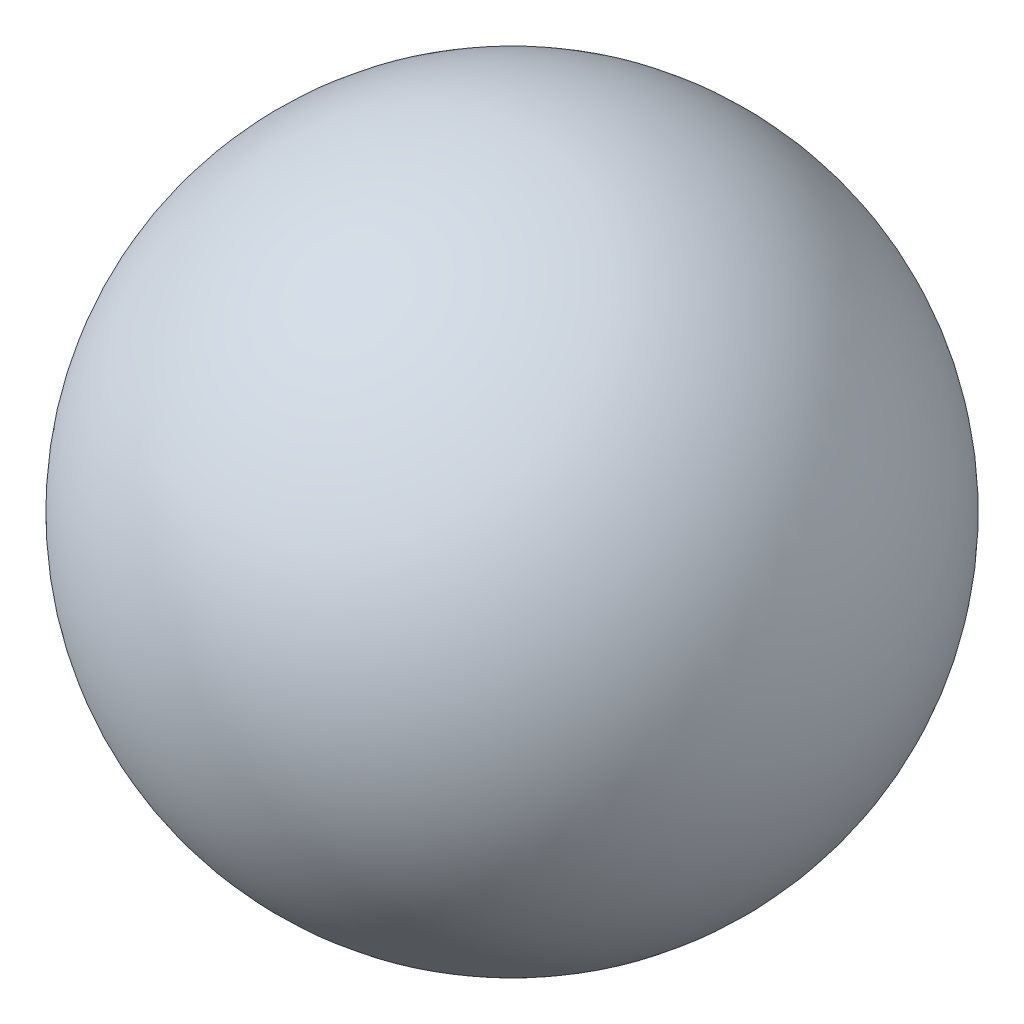
ISO-10303-21;
HEADER;
FILE_DESCRIPTION(('STEP AP214'),'2;1');
FILE_NAME('part.step','',(''),(''),'','','');
FILE_SCHEMA(('AUTOMOTIVE_DESIGN { 1 0 10303 214 1 1 1 1 }'));
ENDSEC;
DATA;
#1=APPLICATION_CONTEXT('core data for automotive mechanical design processes');
#2=APPLICATION_PROTOCOL_DEFINITION('international standard','automotive_design',2000,#1);
#3=PRODUCT_CONTEXT('',#1,'mechanical');
#4=PRODUCT('Part','Part','',(#3));
#5=PRODUCT_RELATED_PRODUCT_CATEGORY('part','',(#4));
#6=PRODUCT_DEFINITION_FORMATION('','',#4);
#7=PRODUCT_DEFINITION_CONTEXT('part definition',#1,'design');
#8=PRODUCT_DEFINITION('design','',#6,#7);
#9=PRODUCT_DEFINITION_SHAPE('','',#8);
#10=(LENGTH_UNIT() NAMED_UNIT(*) SI_UNIT(.MILLI.,.METRE.));
#11=(NAMED_UNIT(*) PLANE_ANGLE_UNIT() SI_UNIT($,.RADIAN.));
#12=(NAMED_UNIT(*) SI_UNIT($,.STERADIAN.) SOLID_ANGLE_UNIT());
#13=UNCERTAINTY_MEASURE_WITH_UNIT(LENGTH_MEASURE(1.E-05),#10,'distance_accuracy_value','');
#14=(GEOMETRIC_REPRESENTATION_CONTEXT(3) GLOBAL_UNCERTAINTY_ASSIGNED_CONTEXT((#13)) GLOBAL_UNIT_ASSIGNED_CONTEXT((#10,
#11,#12)) REPRESENTATION_CONTEXT('',''));
#15=CARTESIAN_POINT('',(0.,0.,0.));
#16=DIRECTION('',(0.,0.,1.));
#17=DIRECTION('',(1.,0.,0.));
#18=AXIS2_PLACEMENT_3D('',#15,#16,#17);
#19=CARTESIAN_POINT('',(0.,0.,0.));
#20=DIRECTION('',(0.,1.,0.));
#21=DIRECTION('',(1.,0.,0.));
#22=AXIS2_PLACEMENT_3D('',#19,#20,#21);
#23=SPHERICAL_SURFACE('',#22,20.32);
#24=CARTESIAN_POINT('',(0.,20.32,0.));
#25=VERTEX_POINT('',#24);
#26=VERTEX_LOOP('',#25);
#27=FACE_BOUND('',#26,.T.);
#28=ADVANCED_FACE('F33',(#27),#23,.T.);
#29=CLOSED_SHELL('',(#28));
#30=MANIFOLD_SOLID_BREP('B2',#29);
#31=ADVANCED_BREP_SHAPE_REPRESENTATION('',(#18,#30),#14);
#32=SHAPE_DEFINITION_REPRESENTATION(#9,#31);
ENDSEC;
END-ISO-10303-21;
